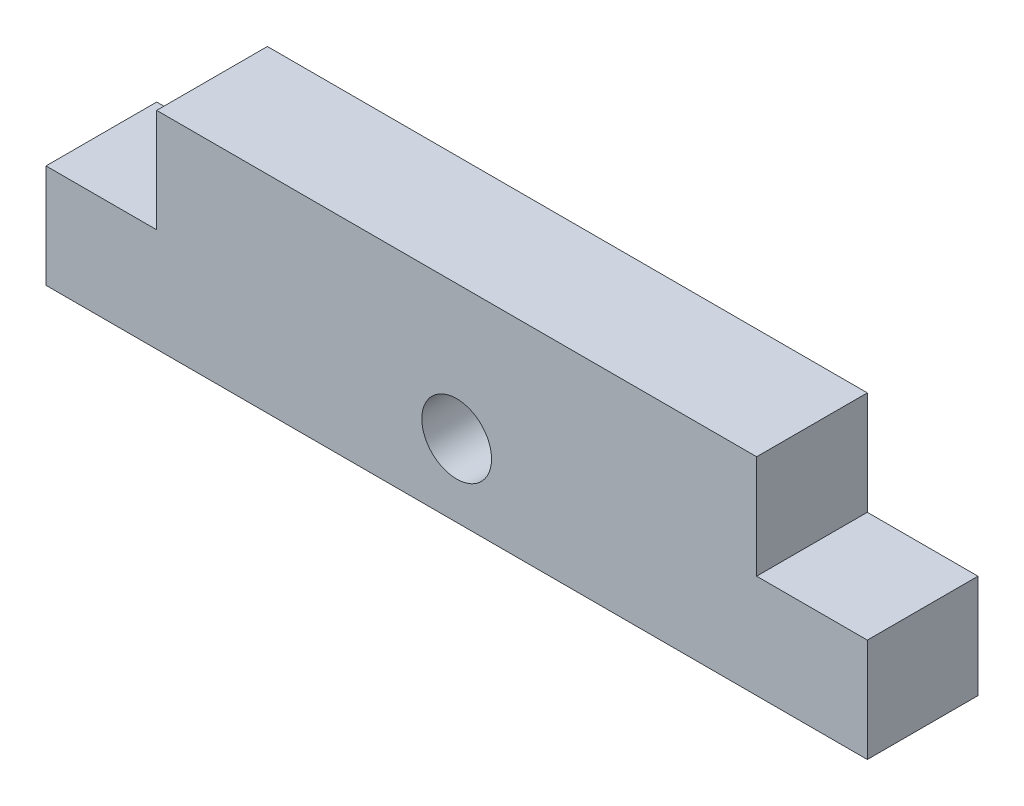
ISO-10303-21;
HEADER;
FILE_DESCRIPTION(('STEP AP214'),'2;1');
FILE_NAME('part.step','',(''),(''),'','','');
FILE_SCHEMA(('AUTOMOTIVE_DESIGN { 1 0 10303 214 1 1 1 1 }'));
ENDSEC;
DATA;
#1=APPLICATION_CONTEXT('core data for automotive mechanical design processes');
#2=APPLICATION_PROTOCOL_DEFINITION('international standard','automotive_design',2000,#1);
#3=PRODUCT_CONTEXT('',#1,'mechanical');
#4=PRODUCT('Part','Part','',(#3));
#5=PRODUCT_RELATED_PRODUCT_CATEGORY('part','',(#4));
#6=PRODUCT_DEFINITION_FORMATION('','',#4);
#7=PRODUCT_DEFINITION_CONTEXT('part definition',#1,'design');
#8=PRODUCT_DEFINITION('design','',#6,#7);
#9=PRODUCT_DEFINITION_SHAPE('','',#8);
#10=(LENGTH_UNIT() NAMED_UNIT(*) SI_UNIT(.MILLI.,.METRE.));
#11=(NAMED_UNIT(*) PLANE_ANGLE_UNIT() SI_UNIT($,.RADIAN.));
#12=(NAMED_UNIT(*) SI_UNIT($,.STERADIAN.) SOLID_ANGLE_UNIT());
#13=UNCERTAINTY_MEASURE_WITH_UNIT(LENGTH_MEASURE(1.E-05),#10,'distance_accuracy_value','');
#14=(GEOMETRIC_REPRESENTATION_CONTEXT(3) GLOBAL_UNCERTAINTY_ASSIGNED_CONTEXT((#13)) GLOBAL_UNIT_ASSIGNED_CONTEXT((#10,
#11,#12)) REPRESENTATION_CONTEXT('',''));
#15=CARTESIAN_POINT('',(0.,0.,0.));
#16=DIRECTION('',(0.,0.,1.));
#17=DIRECTION('',(1.,0.,0.));
#18=AXIS2_PLACEMENT_3D('',#15,#16,#17);
#19=CARTESIAN_POINT('',(0.,0.,5.35));
#20=DIRECTION('',(0.,0.,-1.));
#21=DIRECTION('',(-1.,0.,0.));
#22=AXIS2_PLACEMENT_3D('',#19,#20,#21);
#23=PLANE('',#22);
#24=DIRECTION('',(0.,-1.,0.));
#25=VECTOR('',#24,1.);
#26=CARTESIAN_POINT('',(-19.85,0.,5.35));
#27=LINE('',#26,#25);
#28=CARTESIAN_POINT('',(-19.85,5.,5.35));
#29=VERTEX_POINT('',#28);
#30=CARTESIAN_POINT('',(-19.85,0.,5.35));
#31=VERTEX_POINT('',#30);
#32=EDGE_CURVE('E144',#29,#31,#27,.T.);
#33=ORIENTED_EDGE('',*,*,#32,.T.);
#34=DIRECTION('',(1.,0.,0.));
#35=VECTOR('',#34,1.);
#36=CARTESIAN_POINT('',(-19.85,0.,5.35));
#37=LINE('',#36,#35);
#38=CARTESIAN_POINT('',(19.85,0.,5.35));
#39=VERTEX_POINT('',#38);
#40=EDGE_CURVE('E92',#31,#39,#37,.T.);
#41=ORIENTED_EDGE('',*,*,#40,.T.);
#42=DIRECTION('',(0.,1.,0.));
#43=VECTOR('',#42,1.);
#44=CARTESIAN_POINT('',(19.85,0.,5.35));
#45=LINE('',#44,#43);
#46=CARTESIAN_POINT('',(19.85,5.,5.35));
#47=VERTEX_POINT('',#46);
#48=EDGE_CURVE('E159',#39,#47,#45,.T.);
#49=ORIENTED_EDGE('',*,*,#48,.T.);
#50=DIRECTION('',(-1.,0.,0.));
#51=VECTOR('',#50,1.);
#52=CARTESIAN_POINT('',(19.85,5.,5.35));
#53=LINE('',#52,#51);
#54=CARTESIAN_POINT('',(14.5,5.,5.35));
#55=VERTEX_POINT('',#54);
#56=EDGE_CURVE('E172',#47,#55,#53,.T.);
#57=ORIENTED_EDGE('',*,*,#56,.T.);
#58=DIRECTION('',(0.,1.,0.));
#59=VECTOR('',#58,1.);
#60=CARTESIAN_POINT('',(14.5,10.,5.35));
#61=LINE('',#60,#59);
#62=CARTESIAN_POINT('',(14.5,10.,5.35));
#63=VERTEX_POINT('',#62);
#64=EDGE_CURVE('E111',#55,#63,#61,.T.);
#65=ORIENTED_EDGE('',*,*,#64,.T.);
#66=DIRECTION('',(-1.,0.,0.));
#67=VECTOR('',#66,1.);
#68=CARTESIAN_POINT('',(-14.5,10.,5.35));
#69=LINE('',#68,#67);
#70=CARTESIAN_POINT('',(-14.5,10.,5.35));
#71=VERTEX_POINT('',#70);
#72=EDGE_CURVE('E105',#63,#71,#69,.T.);
#73=ORIENTED_EDGE('',*,*,#72,.T.);
#74=DIRECTION('',(0.,-1.,0.));
#75=VECTOR('',#74,1.);
#76=CARTESIAN_POINT('',(-14.5,10.,5.35));
#77=LINE('',#76,#75);
#78=CARTESIAN_POINT('',(-14.5,5.,5.35));
#79=VERTEX_POINT('',#78);
#80=EDGE_CURVE('E109',#71,#79,#77,.T.);
#81=ORIENTED_EDGE('',*,*,#80,.T.);
#82=DIRECTION('',(-1.,0.,0.));
#83=VECTOR('',#82,1.);
#84=CARTESIAN_POINT('',(-19.85,5.,5.35));
#85=LINE('',#84,#83);
#86=EDGE_CURVE('E49',#79,#29,#85,.T.);
#87=ORIENTED_EDGE('',*,*,#86,.T.);
#88=EDGE_LOOP('',(#33,#41,#49,#57,#65,#73,#81,#87));
#89=FACE_BOUND('',#88,.T.);
#90=CARTESIAN_POINT('',(0.,3.5,5.35));
#91=DIRECTION('',(0.,0.,1.));
#92=DIRECTION('',(1.,0.,0.));
#93=AXIS2_PLACEMENT_3D('',#90,#91,#92);
#94=CIRCLE('',#93,1.685);
#95=CARTESIAN_POINT('',(1.685,3.5,5.35));
#96=VERTEX_POINT('',#95);
#97=EDGE_CURVE('E133',#96,#96,#94,.T.);
#98=ORIENTED_EDGE('',*,*,#97,.F.);
#99=EDGE_LOOP('',(#98));
#100=FACE_BOUND('',#99,.T.);
#101=ADVANCED_FACE('F32',(#89,#100),#23,.F.);
#102=CARTESIAN_POINT('',(0.,0.,0.));
#103=DIRECTION('',(0.,0.,-1.));
#104=DIRECTION('',(-1.,0.,0.));
#105=AXIS2_PLACEMENT_3D('',#102,#103,#104);
#106=PLANE('',#105);
#107=DIRECTION('',(0.,-1.,0.));
#108=VECTOR('',#107,1.);
#109=CARTESIAN_POINT('',(-19.85,0.,0.));
#110=LINE('',#109,#108);
#111=CARTESIAN_POINT('',(-19.85,5.,0.));
#112=VERTEX_POINT('',#111);
#113=CARTESIAN_POINT('',(-19.85,0.,0.));
#114=VERTEX_POINT('',#113);
#115=EDGE_CURVE('E129',#112,#114,#110,.T.);
#116=ORIENTED_EDGE('',*,*,#115,.F.);
#117=DIRECTION('',(-1.,0.,0.));
#118=VECTOR('',#117,1.);
#119=CARTESIAN_POINT('',(-19.85,5.,0.));
#120=LINE('',#119,#118);
#121=CARTESIAN_POINT('',(-14.5,5.,0.));
#122=VERTEX_POINT('',#121);
#123=EDGE_CURVE('E84',#122,#112,#120,.T.);
#124=ORIENTED_EDGE('',*,*,#123,.F.);
#125=DIRECTION('',(0.,-1.,0.));
#126=VECTOR('',#125,1.);
#127=CARTESIAN_POINT('',(-14.5,10.,0.));
#128=LINE('',#127,#126);
#129=CARTESIAN_POINT('',(-14.5,10.,0.));
#130=VERTEX_POINT('',#129);
#131=EDGE_CURVE('E78',#130,#122,#128,.T.);
#132=ORIENTED_EDGE('',*,*,#131,.F.);
#133=DIRECTION('',(-1.,0.,0.));
#134=VECTOR('',#133,1.);
#135=CARTESIAN_POINT('',(-14.5,10.,0.));
#136=LINE('',#135,#134);
#137=CARTESIAN_POINT('',(14.5,10.,0.));
#138=VERTEX_POINT('',#137);
#139=EDGE_CURVE('E119',#138,#130,#136,.T.);
#140=ORIENTED_EDGE('',*,*,#139,.F.);
#141=DIRECTION('',(0.,1.,0.));
#142=VECTOR('',#141,1.);
#143=CARTESIAN_POINT('',(14.5,10.,0.));
#144=LINE('',#143,#142);
#145=CARTESIAN_POINT('',(14.5,5.,0.));
#146=VERTEX_POINT('',#145);
#147=EDGE_CURVE('E139',#146,#138,#144,.T.);
#148=ORIENTED_EDGE('',*,*,#147,.F.);
#149=DIRECTION('',(-1.,0.,0.));
#150=VECTOR('',#149,1.);
#151=CARTESIAN_POINT('',(19.85,5.,0.));
#152=LINE('',#151,#150);
#153=CARTESIAN_POINT('',(19.85,5.,0.));
#154=VERTEX_POINT('',#153);
#155=EDGE_CURVE('E137',#154,#146,#152,.T.);
#156=ORIENTED_EDGE('',*,*,#155,.F.);
#157=DIRECTION('',(0.,1.,0.));
#158=VECTOR('',#157,1.);
#159=CARTESIAN_POINT('',(19.85,0.,0.));
#160=LINE('',#159,#158);
#161=CARTESIAN_POINT('',(19.85,0.,0.));
#162=VERTEX_POINT('',#161);
#163=EDGE_CURVE('E135',#162,#154,#160,.T.);
#164=ORIENTED_EDGE('',*,*,#163,.F.);
#165=DIRECTION('',(1.,0.,0.));
#166=VECTOR('',#165,1.);
#167=CARTESIAN_POINT('',(-19.85,0.,0.));
#168=LINE('',#167,#166);
#169=EDGE_CURVE('E132',#114,#162,#168,.T.);
#170=ORIENTED_EDGE('',*,*,#169,.F.);
#171=EDGE_LOOP('',(#116,#124,#132,#140,#148,#156,#164,#170));
#172=FACE_BOUND('',#171,.T.);
#173=CARTESIAN_POINT('',(0.,3.5,0.));
#174=DIRECTION('',(0.,0.,1.));
#175=DIRECTION('',(1.,0.,0.));
#176=AXIS2_PLACEMENT_3D('',#173,#174,#175);
#177=CIRCLE('',#176,1.685);
#178=CARTESIAN_POINT('',(1.685,3.5,0.));
#179=VERTEX_POINT('',#178);
#180=EDGE_CURVE('E178',#179,#179,#177,.T.);
#181=ORIENTED_EDGE('',*,*,#180,.T.);
#182=EDGE_LOOP('',(#181));
#183=FACE_BOUND('',#182,.T.);
#184=ADVANCED_FACE('F163',(#172,#183),#106,.T.);
#185=CARTESIAN_POINT('',(-19.85,0.,5.35));
#186=DIRECTION('',(1.,0.,0.));
#187=DIRECTION('',(0.,1.,0.));
#188=AXIS2_PLACEMENT_3D('',#185,#186,#187);
#189=PLANE('',#188);
#190=ORIENTED_EDGE('',*,*,#115,.T.);
#191=DIRECTION('',(0.,0.,-1.));
#192=VECTOR('',#191,1.);
#193=CARTESIAN_POINT('',(-19.85,0.,5.35));
#194=LINE('',#193,#192);
#195=EDGE_CURVE('E11',#31,#114,#194,.T.);
#196=ORIENTED_EDGE('',*,*,#195,.F.);
#197=ORIENTED_EDGE('',*,*,#32,.F.);
#198=DIRECTION('',(0.,0.,-1.));
#199=VECTOR('',#198,1.);
#200=CARTESIAN_POINT('',(-19.85,5.,5.35));
#201=LINE('',#200,#199);
#202=EDGE_CURVE('E125',#29,#112,#201,.T.);
#203=ORIENTED_EDGE('',*,*,#202,.T.);
#204=EDGE_LOOP('',(#190,#196,#197,#203));
#205=FACE_BOUND('',#204,.T.);
#206=ADVANCED_FACE('F34',(#205),#189,.F.);
#207=CARTESIAN_POINT('',(-19.85,0.,5.35));
#208=DIRECTION('',(0.,1.,0.));
#209=DIRECTION('',(0.,0.,1.));
#210=AXIS2_PLACEMENT_3D('',#207,#208,#209);
#211=PLANE('',#210);
#212=ORIENTED_EDGE('',*,*,#169,.T.);
#213=DIRECTION('',(0.,0.,-1.));
#214=VECTOR('',#213,1.);
#215=CARTESIAN_POINT('',(19.85,0.,5.35));
#216=LINE('',#215,#214);
#217=EDGE_CURVE('E41',#39,#162,#216,.T.);
#218=ORIENTED_EDGE('',*,*,#217,.F.);
#219=ORIENTED_EDGE('',*,*,#40,.F.);
#220=ORIENTED_EDGE('',*,*,#195,.T.);
#221=EDGE_LOOP('',(#212,#218,#219,#220));
#222=FACE_BOUND('',#221,.T.);
#223=ADVANCED_FACE('F206',(#222),#211,.F.);
#224=CARTESIAN_POINT('',(19.85,0.,5.35));
#225=DIRECTION('',(-1.,0.,0.));
#226=DIRECTION('',(0.,-1.,0.));
#227=AXIS2_PLACEMENT_3D('',#224,#225,#226);
#228=PLANE('',#227);
#229=ORIENTED_EDGE('',*,*,#163,.T.);
#230=DIRECTION('',(0.,0.,-1.));
#231=VECTOR('',#230,1.);
#232=CARTESIAN_POINT('',(19.85,5.,5.35));
#233=LINE('',#232,#231);
#234=EDGE_CURVE('E151',#47,#154,#233,.T.);
#235=ORIENTED_EDGE('',*,*,#234,.F.);
#236=ORIENTED_EDGE('',*,*,#48,.F.);
#237=ORIENTED_EDGE('',*,*,#217,.T.);
#238=EDGE_LOOP('',(#229,#235,#236,#237));
#239=FACE_BOUND('',#238,.T.);
#240=ADVANCED_FACE('F157',(#239),#228,.F.);
#241=CARTESIAN_POINT('',(19.85,5.,5.35));
#242=DIRECTION('',(0.,-1.,0.));
#243=DIRECTION('',(0.,0.,-1.));
#244=AXIS2_PLACEMENT_3D('',#241,#242,#243);
#245=PLANE('',#244);
#246=ORIENTED_EDGE('',*,*,#155,.T.);
#247=DIRECTION('',(0.,0.,-1.));
#248=VECTOR('',#247,1.);
#249=CARTESIAN_POINT('',(14.5,5.,5.35));
#250=LINE('',#249,#248);
#251=EDGE_CURVE('E148',#55,#146,#250,.T.);
#252=ORIENTED_EDGE('',*,*,#251,.F.);
#253=ORIENTED_EDGE('',*,*,#56,.F.);
#254=ORIENTED_EDGE('',*,*,#234,.T.);
#255=EDGE_LOOP('',(#246,#252,#253,#254));
#256=FACE_BOUND('',#255,.T.);
#257=ADVANCED_FACE('F168',(#256),#245,.F.);
#258=CARTESIAN_POINT('',(14.5,10.,5.35));
#259=DIRECTION('',(-1.,0.,0.));
#260=DIRECTION('',(0.,-1.,0.));
#261=AXIS2_PLACEMENT_3D('',#258,#259,#260);
#262=PLANE('',#261);
#263=ORIENTED_EDGE('',*,*,#147,.T.);
#264=DIRECTION('',(0.,0.,-1.));
#265=VECTOR('',#264,1.);
#266=CARTESIAN_POINT('',(14.5,10.,5.35));
#267=LINE('',#266,#265);
#268=EDGE_CURVE('E120',#63,#138,#267,.T.);
#269=ORIENTED_EDGE('',*,*,#268,.F.);
#270=ORIENTED_EDGE('',*,*,#64,.F.);
#271=ORIENTED_EDGE('',*,*,#251,.T.);
#272=EDGE_LOOP('',(#263,#269,#270,#271));
#273=FACE_BOUND('',#272,.T.);
#274=ADVANCED_FACE('F171',(#273),#262,.F.);
#275=CARTESIAN_POINT('',(-14.5,10.,5.35));
#276=DIRECTION('',(0.,-1.,0.));
#277=DIRECTION('',(0.,0.,-1.));
#278=AXIS2_PLACEMENT_3D('',#275,#276,#277);
#279=PLANE('',#278);
#280=ORIENTED_EDGE('',*,*,#139,.T.);
#281=DIRECTION('',(0.,0.,-1.));
#282=VECTOR('',#281,1.);
#283=CARTESIAN_POINT('',(-14.5,10.,5.35));
#284=LINE('',#283,#282);
#285=EDGE_CURVE('E116',#71,#130,#284,.T.);
#286=ORIENTED_EDGE('',*,*,#285,.F.);
#287=ORIENTED_EDGE('',*,*,#72,.F.);
#288=ORIENTED_EDGE('',*,*,#268,.T.);
#289=EDGE_LOOP('',(#280,#286,#287,#288));
#290=FACE_BOUND('',#289,.T.);
#291=ADVANCED_FACE('F117',(#290),#279,.F.);
#292=CARTESIAN_POINT('',(-14.5,10.,5.35));
#293=DIRECTION('',(1.,0.,0.));
#294=DIRECTION('',(0.,1.,0.));
#295=AXIS2_PLACEMENT_3D('',#292,#293,#294);
#296=PLANE('',#295);
#297=ORIENTED_EDGE('',*,*,#131,.T.);
#298=DIRECTION('',(0.,0.,-1.));
#299=VECTOR('',#298,1.);
#300=CARTESIAN_POINT('',(-14.5,5.,5.35));
#301=LINE('',#300,#299);
#302=EDGE_CURVE('E121',#79,#122,#301,.T.);
#303=ORIENTED_EDGE('',*,*,#302,.F.);
#304=ORIENTED_EDGE('',*,*,#80,.F.);
#305=ORIENTED_EDGE('',*,*,#285,.T.);
#306=EDGE_LOOP('',(#297,#303,#304,#305));
#307=FACE_BOUND('',#306,.T.);
#308=ADVANCED_FACE('F123',(#307),#296,.F.);
#309=CARTESIAN_POINT('',(-19.85,5.,5.35));
#310=DIRECTION('',(0.,-1.,0.));
#311=DIRECTION('',(0.,0.,-1.));
#312=AXIS2_PLACEMENT_3D('',#309,#310,#311);
#313=PLANE('',#312);
#314=ORIENTED_EDGE('',*,*,#123,.T.);
#315=ORIENTED_EDGE('',*,*,#202,.F.);
#316=ORIENTED_EDGE('',*,*,#86,.F.);
#317=ORIENTED_EDGE('',*,*,#302,.T.);
#318=EDGE_LOOP('',(#314,#315,#316,#317));
#319=FACE_BOUND('',#318,.T.);
#320=ADVANCED_FACE('F194',(#319),#313,.F.);
#321=CARTESIAN_POINT('',(0.,3.5,5.35));
#322=DIRECTION('',(0.,0.,-1.));
#323=DIRECTION('',(-1.,0.,0.));
#324=AXIS2_PLACEMENT_3D('',#321,#322,#323);
#325=CYLINDRICAL_SURFACE('',#324,1.685);
#326=ORIENTED_EDGE('',*,*,#97,.T.);
#327=EDGE_LOOP('',(#326));
#328=FACE_BOUND('',#327,.T.);
#329=ORIENTED_EDGE('',*,*,#180,.F.);
#330=EDGE_LOOP('',(#329));
#331=FACE_BOUND('',#330,.T.);
#332=ADVANCED_FACE('F184',(#328,#331),#325,.F.);
#333=CLOSED_SHELL('',(#101,#184,#206,#223,#240,#257,#274,#291,#308,#320,#332));
#334=MANIFOLD_SOLID_BREP('B2',#333);
#335=ADVANCED_BREP_SHAPE_REPRESENTATION('',(#18,#334),#14);
#336=SHAPE_DEFINITION_REPRESENTATION(#9,#335);
ENDSEC;
END-ISO-10303-21;
